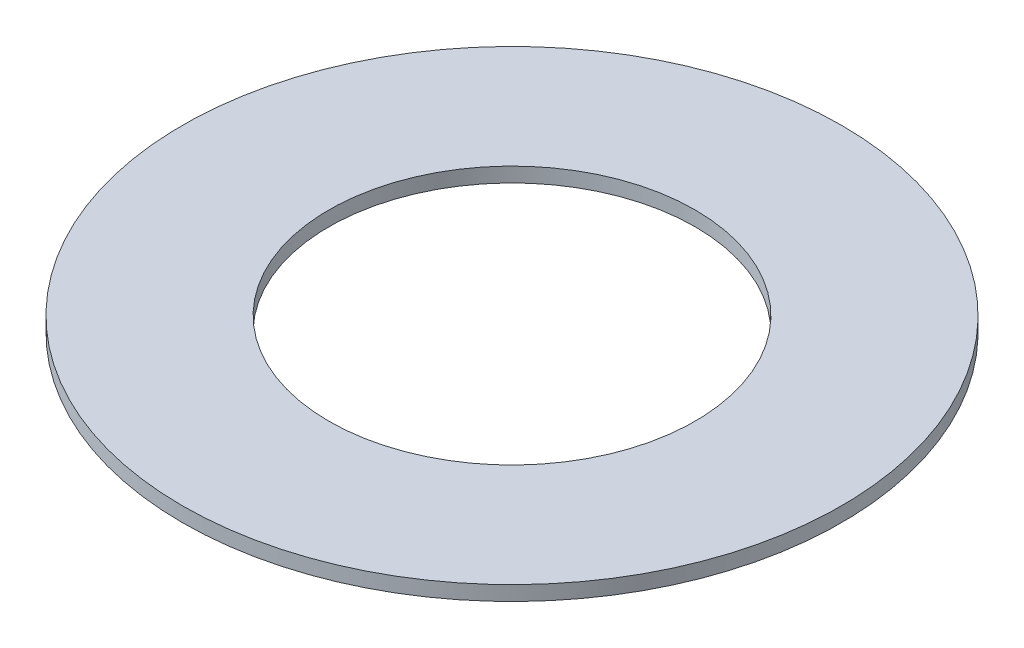
ISO-10303-21;
HEADER;
FILE_DESCRIPTION(('STEP AP214'),'2;1');
FILE_NAME('part.step','',(''),(''),'','','');
FILE_SCHEMA(('AUTOMOTIVE_DESIGN { 1 0 10303 214 1 1 1 1 }'));
ENDSEC;
DATA;
#1=APPLICATION_CONTEXT('core data for automotive mechanical design processes');
#2=APPLICATION_PROTOCOL_DEFINITION('international standard','automotive_design',2000,#1);
#3=PRODUCT_CONTEXT('',#1,'mechanical');
#4=PRODUCT('Part','Part','',(#3));
#5=PRODUCT_RELATED_PRODUCT_CATEGORY('part','',(#4));
#6=PRODUCT_DEFINITION_FORMATION('','',#4);
#7=PRODUCT_DEFINITION_CONTEXT('part definition',#1,'design');
#8=PRODUCT_DEFINITION('design','',#6,#7);
#9=PRODUCT_DEFINITION_SHAPE('','',#8);
#10=(LENGTH_UNIT() NAMED_UNIT(*) SI_UNIT(.MILLI.,.METRE.));
#11=(NAMED_UNIT(*) PLANE_ANGLE_UNIT() SI_UNIT($,.RADIAN.));
#12=(NAMED_UNIT(*) SI_UNIT($,.STERADIAN.) SOLID_ANGLE_UNIT());
#13=UNCERTAINTY_MEASURE_WITH_UNIT(LENGTH_MEASURE(1.E-05),#10,'distance_accuracy_value','');
#14=(GEOMETRIC_REPRESENTATION_CONTEXT(3) GLOBAL_UNCERTAINTY_ASSIGNED_CONTEXT((#13)) GLOBAL_UNIT_ASSIGNED_CONTEXT((#10,
#11,#12)) REPRESENTATION_CONTEXT('',''));
#15=CARTESIAN_POINT('',(0.,0.,0.));
#16=DIRECTION('',(0.,0.,1.));
#17=DIRECTION('',(1.,0.,0.));
#18=AXIS2_PLACEMENT_3D('',#15,#16,#17);
#19=CARTESIAN_POINT('',(0.,2.,0.));
#20=DIRECTION('',(0.,1.,0.));
#21=DIRECTION('',(0.,0.,1.));
#22=AXIS2_PLACEMENT_3D('',#19,#20,#21);
#23=PLANE('',#22);
#24=CARTESIAN_POINT('',(0.,2.,0.));
#25=DIRECTION('',(0.,1.,0.));
#26=DIRECTION('',(0.,0.,1.));
#27=AXIS2_PLACEMENT_3D('',#24,#25,#26);
#28=CIRCLE('',#27,45.);
#29=CARTESIAN_POINT('',(0.,2.,45.));
#30=VERTEX_POINT('',#29);
#31=EDGE_CURVE('E10',#30,#30,#28,.T.);
#32=ORIENTED_EDGE('',*,*,#31,.T.);
#33=EDGE_LOOP('',(#32));
#34=FACE_BOUND('',#33,.T.);
#35=CARTESIAN_POINT('',(0.,2.,0.));
#36=DIRECTION('',(0.,1.,0.));
#37=DIRECTION('',(0.,0.,1.));
#38=AXIS2_PLACEMENT_3D('',#35,#36,#37);
#39=CIRCLE('',#38,25.);
#40=CARTESIAN_POINT('',(0.,2.,25.));
#41=VERTEX_POINT('',#40);
#42=EDGE_CURVE('E49',#41,#41,#39,.T.);
#43=ORIENTED_EDGE('',*,*,#42,.F.);
#44=EDGE_LOOP('',(#43));
#45=FACE_BOUND('',#44,.T.);
#46=ADVANCED_FACE('F39',(#34,#45),#23,.T.);
#47=CARTESIAN_POINT('',(0.,0.,0.));
#48=DIRECTION('',(0.,1.,0.));
#49=DIRECTION('',(0.,0.,1.));
#50=AXIS2_PLACEMENT_3D('',#47,#48,#49);
#51=PLANE('',#50);
#52=CARTESIAN_POINT('',(0.,0.,0.));
#53=DIRECTION('',(0.,1.,0.));
#54=DIRECTION('',(0.,0.,1.));
#55=AXIS2_PLACEMENT_3D('',#52,#53,#54);
#56=CIRCLE('',#55,45.);
#57=CARTESIAN_POINT('',(0.,0.,45.));
#58=VERTEX_POINT('',#57);
#59=EDGE_CURVE('E43',#58,#58,#56,.T.);
#60=ORIENTED_EDGE('',*,*,#59,.F.);
#61=EDGE_LOOP('',(#60));
#62=FACE_BOUND('',#61,.T.);
#63=CARTESIAN_POINT('',(0.,0.,0.));
#64=DIRECTION('',(0.,1.,0.));
#65=DIRECTION('',(0.,0.,1.));
#66=AXIS2_PLACEMENT_3D('',#63,#64,#65);
#67=CIRCLE('',#66,25.);
#68=CARTESIAN_POINT('',(0.,0.,25.));
#69=VERTEX_POINT('',#68);
#70=EDGE_CURVE('E55',#69,#69,#67,.T.);
#71=ORIENTED_EDGE('',*,*,#70,.T.);
#72=EDGE_LOOP('',(#71));
#73=FACE_BOUND('',#72,.T.);
#74=ADVANCED_FACE('F64',(#62,#73),#51,.F.);
#75=CARTESIAN_POINT('',(0.,2.,0.));
#76=DIRECTION('',(0.,-1.,0.));
#77=DIRECTION('',(0.,0.,-1.));
#78=AXIS2_PLACEMENT_3D('',#75,#76,#77);
#79=CYLINDRICAL_SURFACE('',#78,45.);
#80=ORIENTED_EDGE('',*,*,#31,.F.);
#81=EDGE_LOOP('',(#80));
#82=FACE_BOUND('',#81,.T.);
#83=ORIENTED_EDGE('',*,*,#59,.T.);
#84=EDGE_LOOP('',(#83));
#85=FACE_BOUND('',#84,.T.);
#86=ADVANCED_FACE('F41',(#82,#85),#79,.T.);
#87=CARTESIAN_POINT('',(0.,2.,0.));
#88=DIRECTION('',(0.,-1.,0.));
#89=DIRECTION('',(0.,0.,-1.));
#90=AXIS2_PLACEMENT_3D('',#87,#88,#89);
#91=CYLINDRICAL_SURFACE('',#90,25.);
#92=ORIENTED_EDGE('',*,*,#42,.T.);
#93=EDGE_LOOP('',(#92));
#94=FACE_BOUND('',#93,.T.);
#95=ORIENTED_EDGE('',*,*,#70,.F.);
#96=EDGE_LOOP('',(#95));
#97=FACE_BOUND('',#96,.T.);
#98=ADVANCED_FACE('F59',(#94,#97),#91,.F.);
#99=CLOSED_SHELL('',(#46,#74,#86,#98));
#100=MANIFOLD_SOLID_BREP('B2',#99);
#101=ADVANCED_BREP_SHAPE_REPRESENTATION('',(#18,#100),#14);
#102=SHAPE_DEFINITION_REPRESENTATION(#9,#101);
ENDSEC;
END-ISO-10303-21;
